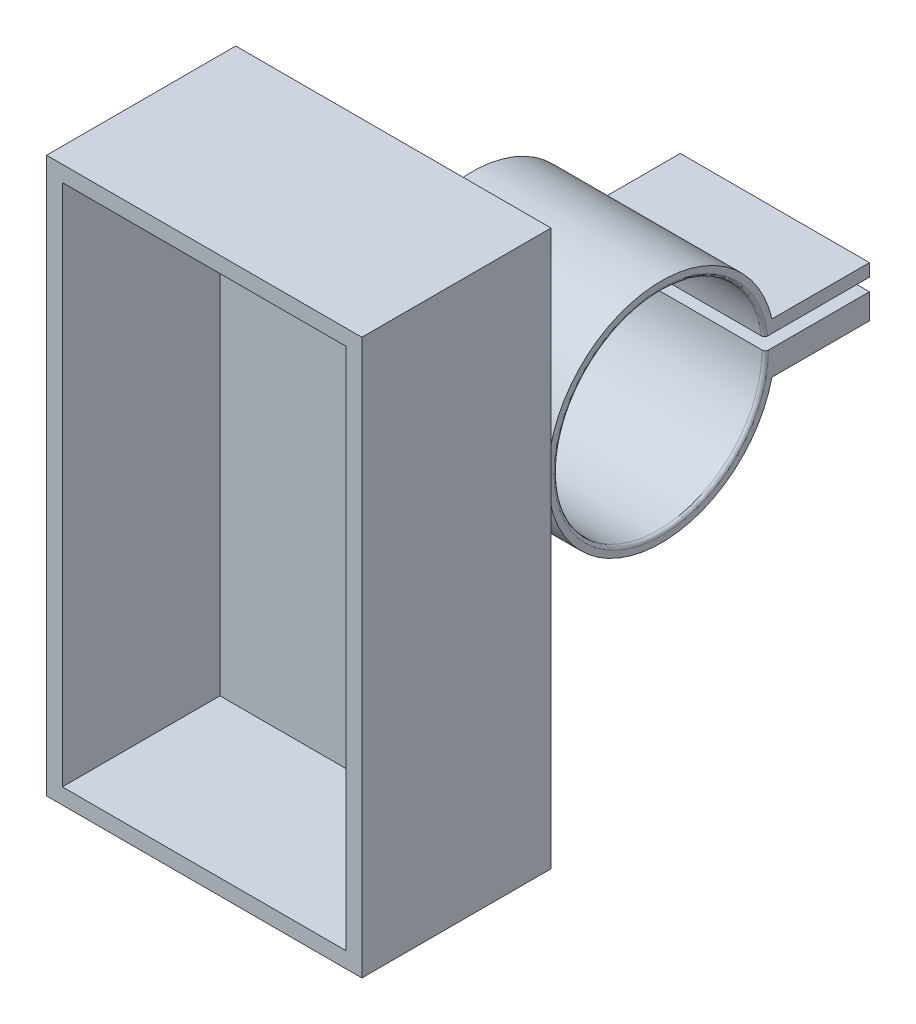
ISO-10303-21;
HEADER;
FILE_DESCRIPTION(('STEP AP214'),'2;1');
FILE_NAME('part.step','',(''),(''),'','','');
FILE_SCHEMA(('AUTOMOTIVE_DESIGN { 1 0 10303 214 1 1 1 1 }'));
ENDSEC;
DATA;
#1=APPLICATION_CONTEXT('core data for automotive mechanical design processes');
#2=APPLICATION_PROTOCOL_DEFINITION('international standard','automotive_design',2000,#1);
#3=PRODUCT_CONTEXT('',#1,'mechanical');
#4=PRODUCT('Part','Part','',(#3));
#5=PRODUCT_RELATED_PRODUCT_CATEGORY('part','',(#4));
#6=PRODUCT_DEFINITION_FORMATION('','',#4);
#7=PRODUCT_DEFINITION_CONTEXT('part definition',#1,'design');
#8=PRODUCT_DEFINITION('design','',#6,#7);
#9=PRODUCT_DEFINITION_SHAPE('','',#8);
#10=(LENGTH_UNIT() NAMED_UNIT(*) SI_UNIT(.MILLI.,.METRE.));
#11=(NAMED_UNIT(*) PLANE_ANGLE_UNIT() SI_UNIT($,.RADIAN.));
#12=(NAMED_UNIT(*) SI_UNIT($,.STERADIAN.) SOLID_ANGLE_UNIT());
#13=UNCERTAINTY_MEASURE_WITH_UNIT(LENGTH_MEASURE(1.E-05),#10,'distance_accuracy_value','');
#14=(GEOMETRIC_REPRESENTATION_CONTEXT(3) GLOBAL_UNCERTAINTY_ASSIGNED_CONTEXT((#13)) GLOBAL_UNIT_ASSIGNED_CONTEXT((#10,
#11,#12)) REPRESENTATION_CONTEXT('',''));
#15=CARTESIAN_POINT('',(0.,0.,0.));
#16=DIRECTION('',(0.,0.,1.));
#17=DIRECTION('',(1.,0.,0.));
#18=AXIS2_PLACEMENT_3D('',#15,#16,#17);
#19=CARTESIAN_POINT('',(-15.,0.,-60.4925687367722));
#20=DIRECTION('',(0.,0.,-1.));
#21=DIRECTION('',(-1.,0.,0.));
#22=AXIS2_PLACEMENT_3D('',#19,#20,#21);
#23=PLANE('',#22);
#24=DIRECTION('',(0.,1.,0.));
#25=VECTOR('',#24,1.);
#26=CARTESIAN_POINT('',(-15.,0.,-60.4925687367722));
#27=LINE('',#26,#25);
#28=CARTESIAN_POINT('',(-15.,-4.,-60.4925687367722));
#29=VERTEX_POINT('',#28);
#30=CARTESIAN_POINT('',(-15.,0.,-60.4925687367722));
#31=VERTEX_POINT('',#30);
#32=EDGE_CURVE('E191',#29,#31,#27,.T.);
#33=ORIENTED_EDGE('',*,*,#32,.T.);
#34=DIRECTION('',(1.,0.,0.));
#35=VECTOR('',#34,1.);
#36=CARTESIAN_POINT('',(-25.,0.,-60.4925687367722));
#37=LINE('',#36,#35);
#38=CARTESIAN_POINT('',(15.,0.,-60.4925687367722));
#39=VERTEX_POINT('',#38);
#40=EDGE_CURVE('E179',#31,#39,#37,.T.);
#41=ORIENTED_EDGE('',*,*,#40,.T.);
#42=DIRECTION('',(0.,1.,0.));
#43=VECTOR('',#42,1.);
#44=CARTESIAN_POINT('',(15.,0.,-60.4925687367722));
#45=LINE('',#44,#43);
#46=CARTESIAN_POINT('',(15.,-4.,-60.4925687367722));
#47=VERTEX_POINT('',#46);
#48=EDGE_CURVE('E193',#47,#39,#45,.T.);
#49=ORIENTED_EDGE('',*,*,#48,.F.);
#50=DIRECTION('',(1.,0.,0.));
#51=VECTOR('',#50,1.);
#52=CARTESIAN_POINT('',(-15.,-4.,-60.4925687367722));
#53=LINE('',#52,#51);
#54=EDGE_CURVE('E226',#29,#47,#53,.T.);
#55=ORIENTED_EDGE('',*,*,#54,.F.);
#56=EDGE_LOOP('',(#33,#41,#49,#55));
#57=FACE_BOUND('',#56,.T.);
#58=ADVANCED_FACE('F50',(#57),#23,.T.);
#59=CARTESIAN_POINT('',(-25.,-44.,30.));
#60=DIRECTION('',(1.,0.,0.));
#61=DIRECTION('',(0.,0.,-1.));
#62=AXIS2_PLACEMENT_3D('',#59,#60,#61);
#63=PLANE('',#62);
#64=DIRECTION('',(0.,-1.,0.));
#65=VECTOR('',#64,1.);
#66=CARTESIAN_POINT('',(-25.,-44.,0.));
#67=LINE('',#66,#65);
#68=CARTESIAN_POINT('',(-25.,44.,0.));
#69=VERTEX_POINT('',#68);
#70=CARTESIAN_POINT('',(-25.,-44.,0.));
#71=VERTEX_POINT('',#70);
#72=EDGE_CURVE('E281',#69,#71,#67,.T.);
#73=ORIENTED_EDGE('',*,*,#72,.T.);
#74=DIRECTION('',(0.,0.,-1.));
#75=VECTOR('',#74,1.);
#76=CARTESIAN_POINT('',(-25.,-44.,30.));
#77=LINE('',#76,#75);
#78=CARTESIAN_POINT('',(-25.,-44.,30.));
#79=VERTEX_POINT('',#78);
#80=EDGE_CURVE('E329',#79,#71,#77,.T.);
#81=ORIENTED_EDGE('',*,*,#80,.F.);
#82=DIRECTION('',(0.,-1.,0.));
#83=VECTOR('',#82,1.);
#84=CARTESIAN_POINT('',(-25.,-44.,30.));
#85=LINE('',#84,#83);
#86=CARTESIAN_POINT('',(-25.,44.,30.));
#87=VERTEX_POINT('',#86);
#88=EDGE_CURVE('E291',#87,#79,#85,.T.);
#89=ORIENTED_EDGE('',*,*,#88,.F.);
#90=DIRECTION('',(0.,0.,-1.));
#91=VECTOR('',#90,1.);
#92=CARTESIAN_POINT('',(-25.,44.,30.));
#93=LINE('',#92,#91);
#94=EDGE_CURVE('E310',#87,#69,#93,.T.);
#95=ORIENTED_EDGE('',*,*,#94,.T.);
#96=EDGE_LOOP('',(#73,#81,#89,#95));
#97=FACE_BOUND('',#96,.T.);
#98=ADVANCED_FACE('F407',(#97),#63,.F.);
#99=CARTESIAN_POINT('',(25.,-44.,30.));
#100=DIRECTION('',(0.,1.,0.));
#101=DIRECTION('',(-1.,0.,0.));
#102=AXIS2_PLACEMENT_3D('',#99,#100,#101);
#103=PLANE('',#102);
#104=DIRECTION('',(1.,0.,0.));
#105=VECTOR('',#104,1.);
#106=CARTESIAN_POINT('',(25.,-44.,0.));
#107=LINE('',#106,#105);
#108=CARTESIAN_POINT('',(25.,-44.,0.));
#109=VERTEX_POINT('',#108);
#110=EDGE_CURVE('E311',#71,#109,#107,.T.);
#111=ORIENTED_EDGE('',*,*,#110,.T.);
#112=DIRECTION('',(0.,0.,-1.));
#113=VECTOR('',#112,1.);
#114=CARTESIAN_POINT('',(25.,-44.,30.));
#115=LINE('',#114,#113);
#116=CARTESIAN_POINT('',(25.,-44.,30.));
#117=VERTEX_POINT('',#116);
#118=EDGE_CURVE('E328',#117,#109,#115,.T.);
#119=ORIENTED_EDGE('',*,*,#118,.F.);
#120=DIRECTION('',(1.,0.,0.));
#121=VECTOR('',#120,1.);
#122=CARTESIAN_POINT('',(25.,-44.,30.));
#123=LINE('',#122,#121);
#124=EDGE_CURVE('E300',#79,#117,#123,.T.);
#125=ORIENTED_EDGE('',*,*,#124,.F.);
#126=ORIENTED_EDGE('',*,*,#80,.T.);
#127=EDGE_LOOP('',(#111,#119,#125,#126));
#128=FACE_BOUND('',#127,.T.);
#129=ADVANCED_FACE('F411',(#128),#103,.F.);
#130=CARTESIAN_POINT('',(25.,-44.,30.));
#131=DIRECTION('',(-1.,0.,0.));
#132=DIRECTION('',(0.,0.,1.));
#133=AXIS2_PLACEMENT_3D('',#130,#131,#132);
#134=PLANE('',#133);
#135=DIRECTION('',(0.,1.,0.));
#136=VECTOR('',#135,1.);
#137=CARTESIAN_POINT('',(25.,-44.,0.));
#138=LINE('',#137,#136);
#139=CARTESIAN_POINT('',(25.,44.,0.));
#140=VERTEX_POINT('',#139);
#141=EDGE_CURVE('E313',#109,#140,#138,.T.);
#142=ORIENTED_EDGE('',*,*,#141,.T.);
#143=DIRECTION('',(0.,0.,-1.));
#144=VECTOR('',#143,1.);
#145=CARTESIAN_POINT('',(25.,44.,30.));
#146=LINE('',#145,#144);
#147=CARTESIAN_POINT('',(25.,44.,30.));
#148=VERTEX_POINT('',#147);
#149=EDGE_CURVE('E325',#148,#140,#146,.T.);
#150=ORIENTED_EDGE('',*,*,#149,.F.);
#151=DIRECTION('',(0.,1.,0.));
#152=VECTOR('',#151,1.);
#153=CARTESIAN_POINT('',(25.,-44.,30.));
#154=LINE('',#153,#152);
#155=EDGE_CURVE('E301',#117,#148,#154,.T.);
#156=ORIENTED_EDGE('',*,*,#155,.F.);
#157=ORIENTED_EDGE('',*,*,#118,.T.);
#158=EDGE_LOOP('',(#142,#150,#156,#157));
#159=FACE_BOUND('',#158,.T.);
#160=ADVANCED_FACE('F420',(#159),#134,.F.);
#161=CARTESIAN_POINT('',(25.,44.,30.));
#162=DIRECTION('',(0.,-1.,0.));
#163=DIRECTION('',(1.,0.,0.));
#164=AXIS2_PLACEMENT_3D('',#161,#162,#163);
#165=PLANE('',#164);
#166=DIRECTION('',(-1.,0.,0.));
#167=VECTOR('',#166,1.);
#168=CARTESIAN_POINT('',(25.,44.,0.));
#169=LINE('',#168,#167);
#170=EDGE_CURVE('E296',#140,#69,#169,.T.);
#171=ORIENTED_EDGE('',*,*,#170,.T.);
#172=ORIENTED_EDGE('',*,*,#94,.F.);
#173=DIRECTION('',(-1.,0.,0.));
#174=VECTOR('',#173,1.);
#175=CARTESIAN_POINT('',(25.,44.,30.));
#176=LINE('',#175,#174);
#177=EDGE_CURVE('E302',#148,#87,#176,.T.);
#178=ORIENTED_EDGE('',*,*,#177,.F.);
#179=ORIENTED_EDGE('',*,*,#149,.T.);
#180=EDGE_LOOP('',(#171,#172,#178,#179));
#181=FACE_BOUND('',#180,.T.);
#182=ADVANCED_FACE('F423',(#181),#165,.F.);
#183=CARTESIAN_POINT('',(0.,0.,30.));
#184=DIRECTION('',(0.,0.,1.));
#185=DIRECTION('',(1.,0.,0.));
#186=AXIS2_PLACEMENT_3D('',#183,#184,#185);
#187=PLANE('',#186);
#188=DIRECTION('',(0.,-1.,0.));
#189=VECTOR('',#188,1.);
#190=CARTESIAN_POINT('',(-22.5,-41.5,30.));
#191=LINE('',#190,#189);
#192=CARTESIAN_POINT('',(-22.5,41.5,30.));
#193=VERTEX_POINT('',#192);
#194=CARTESIAN_POINT('',(-22.5,-41.5,30.));
#195=VERTEX_POINT('',#194);
#196=EDGE_CURVE('E267',#193,#195,#191,.T.);
#197=ORIENTED_EDGE('',*,*,#196,.F.);
#198=DIRECTION('',(-1.,0.,0.));
#199=VECTOR('',#198,1.);
#200=CARTESIAN_POINT('',(22.5,41.5,30.));
#201=LINE('',#200,#199);
#202=CARTESIAN_POINT('',(22.5,41.5,30.));
#203=VERTEX_POINT('',#202);
#204=EDGE_CURVE('E254',#203,#193,#201,.T.);
#205=ORIENTED_EDGE('',*,*,#204,.F.);
#206=DIRECTION('',(0.,1.,0.));
#207=VECTOR('',#206,1.);
#208=CARTESIAN_POINT('',(22.5,-41.5,30.));
#209=LINE('',#208,#207);
#210=CARTESIAN_POINT('',(22.5,-41.5,30.));
#211=VERTEX_POINT('',#210);
#212=EDGE_CURVE('E271',#211,#203,#209,.T.);
#213=ORIENTED_EDGE('',*,*,#212,.F.);
#214=DIRECTION('',(1.,0.,0.));
#215=VECTOR('',#214,1.);
#216=CARTESIAN_POINT('',(22.5,-41.5,30.));
#217=LINE('',#216,#215);
#218=EDGE_CURVE('E266',#195,#211,#217,.T.);
#219=ORIENTED_EDGE('',*,*,#218,.F.);
#220=EDGE_LOOP('',(#197,#205,#213,#219));
#221=FACE_BOUND('',#220,.T.);
#222=ORIENTED_EDGE('',*,*,#88,.T.);
#223=ORIENTED_EDGE('',*,*,#124,.T.);
#224=ORIENTED_EDGE('',*,*,#155,.T.);
#225=ORIENTED_EDGE('',*,*,#177,.T.);
#226=EDGE_LOOP('',(#222,#223,#224,#225));
#227=FACE_BOUND('',#226,.T.);
#228=ADVANCED_FACE('F424',(#221,#227),#187,.T.);
#229=CARTESIAN_POINT('',(0.,0.,0.));
#230=DIRECTION('',(0.,0.,1.));
#231=DIRECTION('',(1.,0.,0.));
#232=AXIS2_PLACEMENT_3D('',#229,#230,#231);
#233=PLANE('',#232);
#234=CARTESIAN_POINT('',(0.,0.,0.));
#235=DIRECTION('',(0.,0.,1.));
#236=DIRECTION('',(1.,0.,0.));
#237=AXIS2_PLACEMENT_3D('',#234,#235,#236);
#238=CIRCLE('',#237,14.25);
#239=CARTESIAN_POINT('',(14.25,0.,0.));
#240=VERTEX_POINT('',#239);
#241=EDGE_CURVE('E336',#240,#240,#238,.T.);
#242=ORIENTED_EDGE('',*,*,#241,.T.);
#243=EDGE_LOOP('',(#242));
#244=FACE_BOUND('',#243,.T.);
#245=ORIENTED_EDGE('',*,*,#72,.F.);
#246=ORIENTED_EDGE('',*,*,#170,.F.);
#247=ORIENTED_EDGE('',*,*,#141,.F.);
#248=ORIENTED_EDGE('',*,*,#110,.F.);
#249=EDGE_LOOP('',(#245,#246,#247,#248));
#250=FACE_BOUND('',#249,.T.);
#251=ADVANCED_FACE('F430',(#244,#250),#233,.F.);
#252=CARTESIAN_POINT('',(-22.5,-41.5,5.));
#253=DIRECTION('',(-1.,0.,0.));
#254=DIRECTION('',(0.,0.,1.));
#255=AXIS2_PLACEMENT_3D('',#252,#253,#254);
#256=PLANE('',#255);
#257=ORIENTED_EDGE('',*,*,#196,.T.);
#258=DIRECTION('',(0.,0.,1.));
#259=VECTOR('',#258,1.);
#260=CARTESIAN_POINT('',(-22.5,-41.5,5.));
#261=LINE('',#260,#259);
#262=CARTESIAN_POINT('',(-22.5,-41.5,5.));
#263=VERTEX_POINT('',#262);
#264=EDGE_CURVE('E264',#263,#195,#261,.T.);
#265=ORIENTED_EDGE('',*,*,#264,.F.);
#266=DIRECTION('',(0.,-1.,0.));
#267=VECTOR('',#266,1.);
#268=CARTESIAN_POINT('',(-22.5,-41.5,5.));
#269=LINE('',#268,#267);
#270=CARTESIAN_POINT('',(-22.5,41.5,5.));
#271=VERTEX_POINT('',#270);
#272=EDGE_CURVE('E247',#271,#263,#269,.T.);
#273=ORIENTED_EDGE('',*,*,#272,.F.);
#274=DIRECTION('',(0.,0.,1.));
#275=VECTOR('',#274,1.);
#276=CARTESIAN_POINT('',(-22.5,41.5,5.));
#277=LINE('',#276,#275);
#278=EDGE_CURVE('E277',#271,#193,#277,.T.);
#279=ORIENTED_EDGE('',*,*,#278,.T.);
#280=EDGE_LOOP('',(#257,#265,#273,#279));
#281=FACE_BOUND('',#280,.T.);
#282=ADVANCED_FACE('F427',(#281),#256,.F.);
#283=CARTESIAN_POINT('',(22.5,41.5,5.));
#284=DIRECTION('',(0.,1.,0.));
#285=DIRECTION('',(0.,0.,1.));
#286=AXIS2_PLACEMENT_3D('',#283,#284,#285);
#287=PLANE('',#286);
#288=ORIENTED_EDGE('',*,*,#204,.T.);
#289=ORIENTED_EDGE('',*,*,#278,.F.);
#290=DIRECTION('',(-1.,0.,0.));
#291=VECTOR('',#290,1.);
#292=CARTESIAN_POINT('',(22.5,41.5,5.));
#293=LINE('',#292,#291);
#294=CARTESIAN_POINT('',(22.5,41.5,5.));
#295=VERTEX_POINT('',#294);
#296=EDGE_CURVE('E263',#295,#271,#293,.T.);
#297=ORIENTED_EDGE('',*,*,#296,.F.);
#298=DIRECTION('',(0.,0.,1.));
#299=VECTOR('',#298,1.);
#300=CARTESIAN_POINT('',(22.5,41.5,5.));
#301=LINE('',#300,#299);
#302=EDGE_CURVE('E282',#295,#203,#301,.T.);
#303=ORIENTED_EDGE('',*,*,#302,.T.);
#304=EDGE_LOOP('',(#288,#289,#297,#303));
#305=FACE_BOUND('',#304,.T.);
#306=ADVANCED_FACE('F440',(#305),#287,.F.);
#307=CARTESIAN_POINT('',(22.5,-41.5,5.));
#308=DIRECTION('',(1.,0.,0.));
#309=DIRECTION('',(0.,0.,-1.));
#310=AXIS2_PLACEMENT_3D('',#307,#308,#309);
#311=PLANE('',#310);
#312=ORIENTED_EDGE('',*,*,#212,.T.);
#313=ORIENTED_EDGE('',*,*,#302,.F.);
#314=DIRECTION('',(0.,1.,0.));
#315=VECTOR('',#314,1.);
#316=CARTESIAN_POINT('',(22.5,-41.5,5.));
#317=LINE('',#316,#315);
#318=CARTESIAN_POINT('',(22.5,-41.5,5.));
#319=VERTEX_POINT('',#318);
#320=EDGE_CURVE('E260',#319,#295,#317,.T.);
#321=ORIENTED_EDGE('',*,*,#320,.F.);
#322=DIRECTION('',(0.,0.,1.));
#323=VECTOR('',#322,1.);
#324=CARTESIAN_POINT('',(22.5,-41.5,5.));
#325=LINE('',#324,#323);
#326=EDGE_CURVE('E290',#319,#211,#325,.T.);
#327=ORIENTED_EDGE('',*,*,#326,.T.);
#328=EDGE_LOOP('',(#312,#313,#321,#327));
#329=FACE_BOUND('',#328,.T.);
#330=ADVANCED_FACE('F442',(#329),#311,.F.);
#331=CARTESIAN_POINT('',(22.5,-41.5,5.));
#332=DIRECTION('',(0.,-1.,0.));
#333=DIRECTION('',(0.,0.,-1.));
#334=AXIS2_PLACEMENT_3D('',#331,#332,#333);
#335=PLANE('',#334);
#336=ORIENTED_EDGE('',*,*,#218,.T.);
#337=ORIENTED_EDGE('',*,*,#326,.F.);
#338=DIRECTION('',(1.,0.,0.));
#339=VECTOR('',#338,1.);
#340=CARTESIAN_POINT('',(22.5,-41.5,5.));
#341=LINE('',#340,#339);
#342=EDGE_CURVE('E255',#263,#319,#341,.T.);
#343=ORIENTED_EDGE('',*,*,#342,.F.);
#344=ORIENTED_EDGE('',*,*,#264,.T.);
#345=EDGE_LOOP('',(#336,#337,#343,#344));
#346=FACE_BOUND('',#345,.T.);
#347=ADVANCED_FACE('F437',(#346),#335,.F.);
#348=CARTESIAN_POINT('',(0.,0.,5.));
#349=DIRECTION('',(0.,0.,1.));
#350=DIRECTION('',(1.,0.,0.));
#351=AXIS2_PLACEMENT_3D('',#348,#349,#350);
#352=PLANE('',#351);
#353=ORIENTED_EDGE('',*,*,#272,.T.);
#354=ORIENTED_EDGE('',*,*,#342,.T.);
#355=ORIENTED_EDGE('',*,*,#320,.T.);
#356=ORIENTED_EDGE('',*,*,#296,.T.);
#357=EDGE_LOOP('',(#353,#354,#355,#356));
#358=FACE_BOUND('',#357,.T.);
#359=ADVANCED_FACE('F445',(#358),#352,.T.);
#360=CARTESIAN_POINT('',(0.,0.,-15.));
#361=DIRECTION('',(0.,0.,1.));
#362=DIRECTION('',(1.,0.,0.));
#363=AXIS2_PLACEMENT_3D('',#360,#361,#362);
#364=CYLINDRICAL_SURFACE('',#363,10.25);
#365=CARTESIAN_POINT('',(10.25,0.,-9.47936499938877));
#366=CARTESIAN_POINT('',(10.249997772282,0.264519076584649,-9.47936701620797));
#367=CARTESIAN_POINT('',(10.2397441218711,0.529124496482216,-9.4852112686551));
#368=CARTESIAN_POINT('',(10.1988524814933,1.0563624821298,-9.5084491330026));
#369=CARTESIAN_POINT('',(10.1682014925191,1.31899368172281,-9.52585010986655));
#370=CARTESIAN_POINT('',(10.0868204809152,1.84076662311007,-9.5718158341821));
#371=CARTESIAN_POINT('',(10.0360439953682,2.09989884525778,-9.60040641267984));
#372=CARTESIAN_POINT('',(9.91506466552643,2.61213502550928,-9.66803447550246));
#373=CARTESIAN_POINT('',(9.84486475035596,2.86523988631563,-9.70707038460409));
#374=CARTESIAN_POINT('',(9.68622852714192,3.36263269484833,-9.79445153895515));
#375=CARTESIAN_POINT('',(9.59788073180206,3.60695691594657,-9.84275152743456));
#376=CARTESIAN_POINT('',(9.40364867835215,4.08666902217371,-9.94769560275203));
#377=CARTESIAN_POINT('',(9.29776382352484,4.32205660288872,-10.0043399735094));
#378=CARTESIAN_POINT('',(9.06947415220393,4.78258886852613,-10.1247269366167));
#379=CARTESIAN_POINT('',(8.94707913500893,5.00773952419547,-10.1884653145558));
#380=CARTESIAN_POINT('',(8.68661251819837,5.44706409397579,-10.321794742583));
#381=CARTESIAN_POINT('',(8.54853514595756,5.66123392370104,-10.3913879453537));
#382=CARTESIAN_POINT('',(8.24718552075165,6.09266328197374,-10.5402036239691));
#383=CARTESIAN_POINT('',(8.08281638148095,6.30904201607955,-10.6197587310245));
#384=CARTESIAN_POINT('',(7.73814156015187,6.72734129410007,-10.7822623976682));
#385=CARTESIAN_POINT('',(7.55783525242426,6.9292612698219,-10.8652110904149));
#386=CARTESIAN_POINT('',(7.18198830136747,7.31811047700305,-11.0327808893572));
#387=CARTESIAN_POINT('',(6.98643093216818,7.50502278048896,-11.1174037535339));
#388=CARTESIAN_POINT('',(6.58108602120329,7.86288155681463,-11.2863340584831));
#389=CARTESIAN_POINT('',(6.37129804311026,8.03382753972565,-11.3706414895003));
#390=CARTESIAN_POINT('',(5.91488391073257,8.37655288293503,-11.5459318841658));
#391=CARTESIAN_POINT('',(5.66672531682515,8.54643210418336,-11.6366536480956));
#392=CARTESIAN_POINT('',(5.1549230262351,8.86453935462094,-11.8124258786654));
#393=CARTESIAN_POINT('',(4.89127716045122,9.01276434079662,-11.8974755473097));
#394=CARTESIAN_POINT('',(4.35008434235251,9.28606725394415,-12.0587906410431));
#395=CARTESIAN_POINT('',(4.07255489521586,9.4111734400318,-12.1350667467784));
#396=CARTESIAN_POINT('',(3.50489612393043,9.63698227375308,-12.2758685051866));
#397=CARTESIAN_POINT('',(3.21477093133944,9.73769285318384,-12.3403979753684));
#398=CARTESIAN_POINT('',(2.68898225772109,9.89392133115211,-12.4421781801048));
#399=CARTESIAN_POINT('',(2.45537095316852,9.95450712622937,-12.4823071358135));
#400=CARTESIAN_POINT('',(1.98300837340899,10.0592578610227,-12.5523654666443));
#401=CARTESIAN_POINT('',(1.74425812652716,10.1034260542443,-12.5822968625368));
#402=CARTESIAN_POINT('',(1.26330476014067,10.1747534875964,-12.6309219714102));
#403=CARTESIAN_POINT('',(1.02110486383679,10.2019276604604,-12.6496255497513));
#404=CARTESIAN_POINT('',(0.534747386523672,10.2389461901088,-12.6751597867866));
#405=CARTESIAN_POINT('',(0.290589766279507,10.2487901987012,-12.6819902069293));
#406=CARTESIAN_POINT('',(-0.198166247123225,10.2510014587125,-12.6835219539042));
#407=CARTESIAN_POINT('',(-0.442764796176201,10.2433455803668,-12.678207228386));
#408=CARTESIAN_POINT('',(-0.93023119910778,10.2106242542887,-12.6556157153616));
#409=CARTESIAN_POINT('',(-1.17309904626852,10.1855587390165,-12.6383388814488));
#410=CARTESIAN_POINT('',(-1.65550574864583,10.1183570148594,-12.5924412208023));
#411=CARTESIAN_POINT('',(-1.89504259388151,10.0762109253703,-12.5638138283159));
#412=CARTESIAN_POINT('',(-2.36910921634494,9.97539772181839,-12.4962039797184));
#413=CARTESIAN_POINT('',(-2.60363887304666,9.91673021055638,-12.4572212746515));
#414=CARTESIAN_POINT('',(-3.06556307278674,9.78378120583667,-12.3702981595879));
#415=CARTESIAN_POINT('',(-3.29298045201288,9.70955724126812,-12.3223908241364));
#416=CARTESIAN_POINT('',(-3.74058008280692,9.54606599529802,-12.2188939536657));
#417=CARTESIAN_POINT('',(-3.96075981439855,9.45679353929937,-12.1633017773125));
#418=CARTESIAN_POINT('',(-4.60906270031334,9.16749207849313,-11.9871703826154));
#419=CARTESIAN_POINT('',(-5.02518101941444,8.94591149227808,-11.8572302605224));
#420=CARTESIAN_POINT('',(-5.88338568601482,8.41089592254884,-11.5619505635708));
#421=CARTESIAN_POINT('',(-6.31905767401842,8.08845317920035,-11.3942687992847));
#422=CARTESIAN_POINT('',(-6.93007100212049,7.55709231450766,-11.1414003860152));
#423=CARTESIAN_POINT('',(-7.12678974729825,7.37186747208288,-11.0568233998803));
#424=CARTESIAN_POINT('',(-7.50535496227567,6.98606905056694,-10.8890354908677));
#425=CARTESIAN_POINT('',(-7.68719903401225,6.78549300663765,-10.8058247899811));
#426=CARTESIAN_POINT('',(-8.05463493304055,6.34636130367998,-10.6334327144376));
#427=CARTESIAN_POINT('',(-8.23834028133085,6.10607276065714,-10.5446350523361));
#428=CARTESIAN_POINT('',(-8.58466358117383,5.6087273259798,-10.3734801024955));
#429=CARTESIAN_POINT('',(-8.74729007019546,5.3516772869605,-10.2911202126955));
#430=CARTESIAN_POINT('',(-9.04998636157031,4.82215933647048,-10.1351171397251));
#431=CARTESIAN_POINT('',(-9.19006110526259,4.54969482021346,-10.0614720479849));
#432=CARTESIAN_POINT('',(-9.44607930661591,3.99104698345921,-9.92504427403318));
#433=CARTESIAN_POINT('',(-9.56202575158638,3.70486536667185,-9.86226024728267));
#434=CARTESIAN_POINT('',(-9.76106877683551,3.14119028883933,-9.75340896982437));
#435=CARTESIAN_POINT('',(-9.84588553448825,2.86447007118699,-9.70648452097918));
#436=CARTESIAN_POINT('',(-9.99211181758109,2.30310780059989,-9.62506289284931));
#437=CARTESIAN_POINT('',(-10.0535222041813,2.01846603952568,-9.59056525636369));
#438=CARTESIAN_POINT('',(-10.1519671963241,1.4439317050169,-9.53505432878852));
#439=CARTESIAN_POINT('',(-10.189021547722,1.15404358132125,-9.51403011491134));
#440=CARTESIAN_POINT('',(-10.2382276924758,0.571496474633397,-9.48607766995324));
#441=CARTESIAN_POINT('',(-10.2503822289675,0.278837800433299,-9.47914788613314));
#442=CARTESIAN_POINT('',(-10.2496464040508,-0.271149396969233,-9.47956587334594));
#443=CARTESIAN_POINT('',(-10.2395957018111,-0.528488532145676,-9.48529482688484));
#444=CARTESIAN_POINT('',(-10.2002210891216,-1.04118963735186,-9.50767214025927));
#445=CARTESIAN_POINT('',(-10.1708990484919,-1.29655179676776,-9.52431944073138));
#446=CARTESIAN_POINT('',(-10.0933531995476,-1.80346124099976,-9.56813225679973));
#447=CARTESIAN_POINT('',(-10.0451294749466,-2.05500854270637,-9.59529772581208));
#448=CARTESIAN_POINT('',(-9.93035506290933,-2.55259576736652,-9.65951116446066));
#449=CARTESIAN_POINT('',(-9.86380381575373,-2.79863552187238,-9.69655943591484));
#450=CARTESIAN_POINT('',(-9.71383669852147,-3.28133140146672,-9.77930134854855));
#451=CARTESIAN_POINT('',(-9.63059028276788,-3.51805529762093,-9.8249078471487));
#452=CARTESIAN_POINT('',(-9.44761573217907,-3.98341490915179,-9.92405156519192));
#453=CARTESIAN_POINT('',(-9.34788176618569,-4.21204772809716,-9.97759158979122));
#454=CARTESIAN_POINT('',(-9.13282406546957,-4.66001584079167,-10.0915054494092));
#455=CARTESIAN_POINT('',(-9.01750350200322,-4.87935301394384,-10.1518778938952));
#456=CARTESIAN_POINT('',(-8.77206454775717,-5.30795618018436,-10.2783315545162));
#457=CARTESIAN_POINT('',(-8.64194082516845,-5.51721850564016,-10.3444148255065));
#458=CARTESIAN_POINT('',(-8.35352278121774,-5.94597758022981,-10.4881429554006));
#459=CARTESIAN_POINT('',(-8.19370656639242,-6.16428772819165,-10.5662762688494));
#460=CARTESIAN_POINT('',(-7.85802313299172,-6.58686805012573,-10.7263279305793));
#461=CARTESIAN_POINT('',(-7.68214863933788,-6.79113178627599,-10.8082479860333));
#462=CARTESIAN_POINT('',(-7.31516505188381,-7.18493998299601,-10.9741437890637));
#463=CARTESIAN_POINT('',(-7.12404291319149,-7.37447156001425,-11.058121253334));
#464=CARTESIAN_POINT('',(-6.72752867936334,-7.73790629448114,-11.2262145569714));
#465=CARTESIAN_POINT('',(-6.52213603190281,-7.91180884642705,-11.3103304015711));
#466=CARTESIAN_POINT('',(-6.07442669975909,-8.2615485261043,-11.485953666827));
#467=CARTESIAN_POINT('',(-5.83053633706579,-8.43548237750633,-11.5772527274582));
#468=CARTESIAN_POINT('',(-5.32712404825027,-8.76209346115811,-11.75485264458));
#469=CARTESIAN_POINT('',(-5.06759991232121,-8.91476767824772,-11.841152791085));
#470=CARTESIAN_POINT('',(-4.53440208671995,-9.19742594230974,-12.0057074086744));
#471=CARTESIAN_POINT('',(-4.26074412936347,-9.32743454163621,-12.0839705475252));
#472=CARTESIAN_POINT('',(-3.7005113451067,-9.56352655906522,-12.2295055172165));
#473=CARTESIAN_POINT('',(-3.41394051216499,-9.66961731484302,-12.2967807172601));
#474=CARTESIAN_POINT('',(-2.89199587721539,-9.83652052783761,-12.4045344971486));
#475=CARTESIAN_POINT('',(-2.65870573257551,-9.90216401255776,-12.4476688831337));
#476=CARTESIAN_POINT('',(-2.18652964603533,-10.017015040232,-12.5239587900922));
#477=CARTESIAN_POINT('',(-1.94764482682675,-10.0662258510203,-12.5571162949581));
#478=CARTESIAN_POINT('',(-1.46593476099523,-10.1475683117232,-12.6123115043365));
#479=CARTESIAN_POINT('',(-1.22311337196106,-10.1797157499175,-12.6343594872297));
#480=CARTESIAN_POINT('',(-0.734995046002121,-10.2265531746891,-12.6665858910638));
#481=CARTESIAN_POINT('',(-0.48969806941139,-10.2412428810945,-12.6767641215118));
#482=CARTESIAN_POINT('',(0.00199391500462832,-10.2529549532952,-12.6848738725892));
#483=CARTESIAN_POINT('',(0.248390126661427,-10.2499433578976,-12.6827818518948));
#484=CARTESIAN_POINT('',(0.739914698825937,-10.2262196999597,-12.6663762748288));
#485=CARTESIAN_POINT('',(0.985043054643484,-10.2055075719872,-12.6520626732785));
#486=CARTESIAN_POINT('',(1.47235022120758,-10.1466721223633,-12.6117387739645));
#487=CARTESIAN_POINT('',(1.71452736389064,-10.1085393839905,-12.585722150242));
#488=CARTESIAN_POINT('',(2.19417218406893,-10.0153784215539,-12.5229168576762));
#489=CARTESIAN_POINT('',(2.43163977569422,-9.96034988972743,-12.4861279926134));
#490=CARTESIAN_POINT('',(2.89679952074493,-9.83504728342829,-12.4036437187107));
#491=CARTESIAN_POINT('',(3.12458668778807,-9.76502666129928,-12.35809752686));
#492=CARTESIAN_POINT('',(3.57324020221696,-9.60993437035669,-12.2590622254572));
#493=CARTESIAN_POINT('',(3.79410414785559,-9.5248575449251,-12.2055703956052));
#494=CARTESIAN_POINT('',(4.44487193832846,-9.24812016742324,-12.0352971408735));
#495=CARTESIAN_POINT('',(4.8631923493345,-9.03488700573248,-11.9086727815464));
#496=CARTESIAN_POINT('',(5.72496924385396,-8.51920105558191,-11.6198858699287));
#497=CARTESIAN_POINT('',(6.16240681968389,-8.20807255308407,-11.4552524336377));
#498=CARTESIAN_POINT('',(6.77750771694413,-7.69411782238787,-11.2055496630691));
#499=CARTESIAN_POINT('',(6.97583019979468,-7.51477243657646,-11.1217936813681));
#500=CARTESIAN_POINT('',(7.35812399046556,-7.14086665772668,-10.9551443540285));
#501=CARTESIAN_POINT('',(7.54209303888388,-6.94630387890247,-10.8722511459733));
#502=CARTESIAN_POINT('',(7.91631229049929,-6.51804831284799,-10.6991769434172));
#503=CARTESIAN_POINT('',(8.10458116566939,-6.28247958487988,-10.6093437841493));
#504=CARTESIAN_POINT('',(8.46046511910795,-5.79432635076227,-10.435513560322));
#505=CARTESIAN_POINT('',(8.62808771969152,-5.54174809409541,-10.351514375092));
#506=CARTESIAN_POINT('',(8.94125851803259,-5.02083079577813,-10.1916388130479));
#507=CARTESIAN_POINT('',(9.08680877109352,-4.75249322481455,-10.1157616801292));
#508=CARTESIAN_POINT('',(9.35423941528465,-4.20170924201309,-9.97432541105525));
#509=CARTESIAN_POINT('',(9.47612633535899,-3.91926674897732,-9.90876342979832));
#510=CARTESIAN_POINT('',(9.67526367811933,-3.39354727480499,-9.80049186361761));
#511=CARTESIAN_POINT('',(9.75659691704004,-3.15221881009947,-9.75579160224726));
#512=CARTESIAN_POINT('',(9.90137740723689,-2.6627657536646,-9.67568189483599));
#513=CARTESIAN_POINT('',(9.9648278159665,-2.41464237016818,-9.64027080874316));
#514=CARTESIAN_POINT('',(10.0730047348587,-1.91378309502982,-9.57961850769514));
#515=CARTESIAN_POINT('',(10.1177773897455,-1.66106020011982,-9.55435223512476));
#516=CARTESIAN_POINT('',(10.1882648113444,-1.15223860920685,-9.51447180275596));
#517=CARTESIAN_POINT('',(10.2139906354492,-0.896141959829225,-9.49985146267976));
#518=CARTESIAN_POINT('',(10.236691016893,-0.532947417528673,-9.48694096180553));
#519=CARTESIAN_POINT('',(10.241679945674,-0.42644910368736,-9.48410172453271));
#520=CARTESIAN_POINT('',(10.2483350472964,-0.213305214843409,-9.48031324517058));
#521=CARTESIAN_POINT('',(10.2500008982625,-0.106659626576729,-9.47936418616506));
#522=CARTESIAN_POINT('',(10.25,0.,-9.47936499938877));
#523=B_SPLINE_CURVE_WITH_KNOTS('',3,(#365,#366,#367,#368,#369,#370,#371,#372,#373,#374,#375,
#376,#377,#378,#379,#380,#381,#382,#383,#384,#385,#386,#387,#388,#389,#390,#391,#392,#393,#394,
#395,#396,#397,#398,#399,#400,#401,#402,#403,#404,#405,#406,#407,#408,#409,#410,#411,#412,#413,
#414,#415,#416,#417,#418,#419,#420,#421,#422,#423,#424,#425,#426,#427,#428,#429,#430,#431,#432,
#433,#434,#435,#436,#437,#438,#439,#440,#441,#442,#443,#444,#445,#446,#447,#448,#449,#450,#451,
#452,#453,#454,#455,#456,#457,#458,#459,#460,#461,#462,#463,#464,#465,#466,#467,#468,#469,#470,
#471,#472,#473,#474,#475,#476,#477,#478,#479,#480,#481,#482,#483,#484,#485,#486,#487,#488,#489,
#490,#491,#492,#493,#494,#495,#496,#497,#498,#499,#500,#501,#502,#503,#504,#505,#506,#507,#508,
#509,#510,#511,#512,#513,#514,#515,#516,#517,#518,#519,#520,#521,#522),.UNSPECIFIED.,.T.,.F.,(4,
2,2,2,2,2,2,2,2,2,2,2,2,2,2,2,2,2,2,2,2,2,2,2,2,2,2,2,2,2,2,2,2,2,2,2,2,2,2,2,2,2,2,2,2,2,2,2,2,
2,2,2,2,2,2,2,2,2,2,2,2,2,2,2,2,2,2,2,2,2,2,2,2,2,2,2,2,2,4),(0.,0.793445699109753,
1.58739753759623,2.38319311789402,3.17886875465465,3.97075205481194,4.76266230518596,
5.55410458333749,6.34583913888313,7.19437837647321,8.04295094124411,8.8924675904174,
9.74201029856779,10.6832148302329,11.624551499967,12.5647298098344,13.5046020259332,
14.2378090633033,14.9708707221559,15.7032873275039,16.4357186481567,17.1691185898199,
17.9025213766886,18.6363490222081,19.370194311529,20.1013722161059,20.8328020594295,
22.2949325934273,23.9898631389846,24.8385881334854,25.687449689039,26.6319596306501,
27.5760858185183,28.5200048554331,29.4638069567065,30.3421746895656,31.2205101026669,
32.0981325530263,32.9756583132331,33.7475122146744,34.5192912373032,35.2910668418398,
36.0628660188806,36.8271955080344,37.5917958984856,38.3562409565093,39.1209622297126,
39.9649290152673,40.8092800687716,41.6543614043125,42.4994754660588,43.4378275513089,
44.3763125836439,45.3137746059713,46.2509486349044,46.9886740504942,47.7262526730524,
48.463147638996,49.2000544309006,49.9383754912364,50.6766992808842,51.4154226449912,
52.1541594659907,52.8812749085927,53.6086398655321,55.062616903003,56.7400709183012,
57.5800411074373,58.4201432522616,59.3629428971072,60.3053980174659,61.2477653255874,
62.1898722547115,62.9647291342734,63.7394491166323,64.5122435975997,65.2845890901276,
65.6044920138884,65.9244259221292),.UNSPECIFIED.);
#524=CARTESIAN_POINT('',(10.25,0.,-9.47936499938877));
#525=VERTEX_POINT('',#524);
#526=EDGE_CURVE('E250',#525,#525,#523,.T.);
#527=ORIENTED_EDGE('',*,*,#526,.T.);
#528=EDGE_LOOP('',(#527));
#529=FACE_BOUND('',#528,.T.);
#530=CARTESIAN_POINT('',(0.,0.,-4.));
#531=DIRECTION('',(0.,0.,1.));
#532=DIRECTION('',(1.,0.,0.));
#533=AXIS2_PLACEMENT_3D('',#530,#531,#532);
#534=CIRCLE('',#533,10.25);
#535=CARTESIAN_POINT('',(10.25,0.,-4.));
#536=VERTEX_POINT('',#535);
#537=EDGE_CURVE('E331',#536,#536,#534,.F.);
#538=ORIENTED_EDGE('',*,*,#537,.T.);
#539=EDGE_LOOP('',(#538));
#540=FACE_BOUND('',#539,.T.);
#541=ADVANCED_FACE('F355',(#529,#540),#364,.T.);
#542=CARTESIAN_POINT('',(0.,0.,-4.));
#543=DIRECTION('',(0.,0.,1.));
#544=DIRECTION('',(1.,0.,0.));
#545=AXIS2_PLACEMENT_3D('',#542,#543,#544);
#546=TOROIDAL_SURFACE('',#545,14.25,4.);
#547=ORIENTED_EDGE('',*,*,#241,.F.);
#548=EDGE_LOOP('',(#547));
#549=FACE_BOUND('',#548,.T.);
#550=ORIENTED_EDGE('',*,*,#537,.F.);
#551=EDGE_LOOP('',(#550));
#552=FACE_BOUND('',#551,.T.);
#553=ADVANCED_FACE('F359',(#549,#552),#546,.F.);
#554=CARTESIAN_POINT('',(-15.,0.,-27.4793649993888));
#555=DIRECTION('',(1.,0.,0.));
#556=DIRECTION('',(0.,0.,-1.));
#557=AXIS2_PLACEMENT_3D('',#554,#555,#556);
#558=CYLINDRICAL_SURFACE('',#557,18.);
#559=DIRECTION('',(1.,0.,0.));
#560=VECTOR('',#559,1.);
#561=CARTESIAN_POINT('',(-15.,-4.,-45.029293774173));
#562=LINE('',#561,#560);
#563=CARTESIAN_POINT('',(-15.,-4.,-45.029293774173));
#564=VERTEX_POINT('',#563);
#565=CARTESIAN_POINT('',(15.,-4.,-45.029293774173));
#566=VERTEX_POINT('',#565);
#567=EDGE_CURVE('E235',#564,#566,#562,.T.);
#568=ORIENTED_EDGE('',*,*,#567,.T.);
#569=CARTESIAN_POINT('',(15.,0.,-27.4793649993888));
#570=DIRECTION('',(1.,0.,0.));
#571=DIRECTION('',(0.,0.,-1.));
#572=AXIS2_PLACEMENT_3D('',#569,#570,#571);
#573=CIRCLE('',#572,18.);
#574=CARTESIAN_POINT('',(15.,4.,-45.029293774173));
#575=VERTEX_POINT('',#574);
#576=EDGE_CURVE('E233',#575,#566,#573,.T.);
#577=ORIENTED_EDGE('',*,*,#576,.F.);
#578=DIRECTION('',(1.,0.,0.));
#579=VECTOR('',#578,1.);
#580=CARTESIAN_POINT('',(-15.,4.,-45.029293774173));
#581=LINE('',#580,#579);
#582=CARTESIAN_POINT('',(-15.,4.,-45.029293774173));
#583=VERTEX_POINT('',#582);
#584=EDGE_CURVE('E232',#583,#575,#581,.T.);
#585=ORIENTED_EDGE('',*,*,#584,.F.);
#586=CARTESIAN_POINT('',(-15.,0.,-27.4793649993888));
#587=DIRECTION('',(1.,0.,0.));
#588=DIRECTION('',(0.,0.,-1.));
#589=AXIS2_PLACEMENT_3D('',#586,#587,#588);
#590=CIRCLE('',#589,18.);
#591=EDGE_CURVE('E242',#583,#564,#590,.T.);
#592=ORIENTED_EDGE('',*,*,#591,.T.);
#593=EDGE_LOOP('',(#568,#577,#585,#592));
#594=FACE_BOUND('',#593,.T.);
#595=ORIENTED_EDGE('',*,*,#526,.F.);
#596=EDGE_LOOP('',(#595));
#597=FACE_BOUND('',#596,.T.);
#598=ADVANCED_FACE('F353',(#594,#597),#558,.T.);
#599=CARTESIAN_POINT('',(-15.,0.,-27.4793649993888));
#600=DIRECTION('',(1.,0.,0.));
#601=DIRECTION('',(0.,0.,-1.));
#602=AXIS2_PLACEMENT_3D('',#599,#600,#601);
#603=PLANE('',#602);
#604=DIRECTION('',(0.,0.,1.));
#605=VECTOR('',#604,1.);
#606=CARTESIAN_POINT('',(-15.,2.,-27.4793649993888));
#607=LINE('',#606,#605);
#608=CARTESIAN_POINT('',(-15.,2.,-60.4925687367722));
#609=VERTEX_POINT('',#608);
#610=CARTESIAN_POINT('',(-15.,2.,-44.3613080155229));
#611=VERTEX_POINT('',#610);
#612=EDGE_CURVE('E621',#609,#611,#607,.T.);
#613=ORIENTED_EDGE('',*,*,#612,.T.);
#614=CARTESIAN_POINT('',(-15.,0.,-27.4793649993888));
#615=DIRECTION('',(1.,0.,0.));
#616=DIRECTION('',(0.,0.,-1.));
#617=AXIS2_PLACEMENT_3D('',#614,#615,#616);
#618=CIRCLE('',#617,17.);
#619=CARTESIAN_POINT('',(-15.,0.,-44.4793649993888));
#620=VERTEX_POINT('',#619);
#621=EDGE_CURVE('E396',#611,#620,#618,.T.);
#622=ORIENTED_EDGE('',*,*,#621,.T.);
#623=DIRECTION('',(0.,0.,-1.));
#624=VECTOR('',#623,1.);
#625=CARTESIAN_POINT('',(-15.,0.,-27.4793649993888));
#626=LINE('',#625,#624);
#627=EDGE_CURVE('E208',#620,#31,#626,.T.);
#628=ORIENTED_EDGE('',*,*,#627,.T.);
#629=ORIENTED_EDGE('',*,*,#32,.F.);
#630=DIRECTION('',(0.,0.,-1.));
#631=VECTOR('',#630,1.);
#632=CARTESIAN_POINT('',(-15.,-4.,-60.4925687367722));
#633=LINE('',#632,#631);
#634=EDGE_CURVE('E224',#564,#29,#633,.T.);
#635=ORIENTED_EDGE('',*,*,#634,.F.);
#636=ORIENTED_EDGE('',*,*,#591,.F.);
#637=DIRECTION('',(0.,0.,1.));
#638=VECTOR('',#637,1.);
#639=CARTESIAN_POINT('',(-15.,4.,-60.4925687367722));
#640=LINE('',#639,#638);
#641=CARTESIAN_POINT('',(-15.,4.,-60.4925687367722));
#642=VERTEX_POINT('',#641);
#643=EDGE_CURVE('E217',#642,#583,#640,.T.);
#644=ORIENTED_EDGE('',*,*,#643,.F.);
#645=EDGE_CURVE('E218',#609,#642,#27,.T.);
#646=ORIENTED_EDGE('',*,*,#645,.F.);
#647=EDGE_LOOP('',(#613,#622,#628,#629,#635,#636,#644,#646));
#648=FACE_BOUND('',#647,.T.);
#649=ADVANCED_FACE('F360',(#648),#603,.F.);
#650=CARTESIAN_POINT('',(15.,0.,-27.4793649993888));
#651=DIRECTION('',(1.,0.,0.));
#652=DIRECTION('',(0.,0.,-1.));
#653=AXIS2_PLACEMENT_3D('',#650,#651,#652);
#654=PLANE('',#653);
#655=DIRECTION('',(0.,0.,-1.));
#656=VECTOR('',#655,1.);
#657=CARTESIAN_POINT('',(15.,0.,-43.4925687367722));
#658=LINE('',#657,#656);
#659=CARTESIAN_POINT('',(15.,0.,-44.4793649993888));
#660=VERTEX_POINT('',#659);
#661=EDGE_CURVE('E180',#660,#39,#658,.T.);
#662=ORIENTED_EDGE('',*,*,#661,.F.);
#663=CARTESIAN_POINT('',(15.,0.,-27.4793649993888));
#664=DIRECTION('',(1.,0.,0.));
#665=DIRECTION('',(0.,0.,-1.));
#666=AXIS2_PLACEMENT_3D('',#663,#664,#665);
#667=CIRCLE('',#666,17.);
#668=CARTESIAN_POINT('',(15.,2.,-44.3613080155229));
#669=VERTEX_POINT('',#668);
#670=EDGE_CURVE('E398',#660,#669,#667,.F.);
#671=ORIENTED_EDGE('',*,*,#670,.T.);
#672=DIRECTION('',(0.,0.,1.));
#673=VECTOR('',#672,1.);
#674=CARTESIAN_POINT('',(15.,2.,-60.4925687367722));
#675=LINE('',#674,#673);
#676=CARTESIAN_POINT('',(15.,2.,-60.4925687367722));
#677=VERTEX_POINT('',#676);
#678=EDGE_CURVE('E190',#677,#669,#675,.T.);
#679=ORIENTED_EDGE('',*,*,#678,.F.);
#680=CARTESIAN_POINT('',(15.,4.,-60.4925687367722));
#681=VERTEX_POINT('',#680);
#682=EDGE_CURVE('E201',#677,#681,#45,.T.);
#683=ORIENTED_EDGE('',*,*,#682,.T.);
#684=DIRECTION('',(0.,0.,1.));
#685=VECTOR('',#684,1.);
#686=CARTESIAN_POINT('',(15.,4.,-60.4925687367722));
#687=LINE('',#686,#685);
#688=EDGE_CURVE('E204',#681,#575,#687,.T.);
#689=ORIENTED_EDGE('',*,*,#688,.T.);
#690=ORIENTED_EDGE('',*,*,#576,.T.);
#691=DIRECTION('',(0.,0.,-1.));
#692=VECTOR('',#691,1.);
#693=CARTESIAN_POINT('',(15.,-4.,-60.4925687367722));
#694=LINE('',#693,#692);
#695=EDGE_CURVE('E202',#566,#47,#694,.T.);
#696=ORIENTED_EDGE('',*,*,#695,.T.);
#697=ORIENTED_EDGE('',*,*,#48,.T.);
#698=EDGE_LOOP('',(#662,#671,#679,#683,#689,#690,#696,#697));
#699=FACE_BOUND('',#698,.T.);
#700=ADVANCED_FACE('F196',(#699),#654,.T.);
#701=CARTESIAN_POINT('',(-25.,0.,-27.4793649993888));
#702=DIRECTION('',(1.,0.,0.));
#703=DIRECTION('',(0.,0.,-1.));
#704=AXIS2_PLACEMENT_3D('',#701,#702,#703);
#705=CYLINDRICAL_SURFACE('',#704,16.5);
#706=DIRECTION('',(1.,0.,0.));
#707=VECTOR('',#706,1.);
#708=CARTESIAN_POINT('',(-25.,0.,-43.9793649993888));
#709=LINE('',#708,#707);
#710=CARTESIAN_POINT('',(14.5,0.,-43.9793649993888));
#711=VERTEX_POINT('',#710);
#712=CARTESIAN_POINT('',(-14.5,0.,-43.9793649993888));
#713=VERTEX_POINT('',#712);
#714=EDGE_CURVE('E642',#711,#713,#709,.F.);
#715=ORIENTED_EDGE('',*,*,#714,.T.);
#716=CARTESIAN_POINT('',(-14.5,0.,-27.4793649993888));
#717=DIRECTION('',(1.,0.,0.));
#718=DIRECTION('',(0.,0.,-1.));
#719=AXIS2_PLACEMENT_3D('',#716,#717,#718);
#720=CIRCLE('',#719,16.5);
#721=CARTESIAN_POINT('',(-14.5,2.,-43.857704353548));
#722=VERTEX_POINT('',#721);
#723=EDGE_CURVE('E65',#713,#722,#720,.F.);
#724=ORIENTED_EDGE('',*,*,#723,.T.);
#725=DIRECTION('',(1.,0.,0.));
#726=VECTOR('',#725,1.);
#727=CARTESIAN_POINT('',(-25.,2.,-43.857704353548));
#728=LINE('',#727,#726);
#729=CARTESIAN_POINT('',(14.5,2.,-43.857704353548));
#730=VERTEX_POINT('',#729);
#731=EDGE_CURVE('E345',#722,#730,#728,.T.);
#732=ORIENTED_EDGE('',*,*,#731,.T.);
#733=CARTESIAN_POINT('',(14.5,0.,-27.4793649993888));
#734=DIRECTION('',(1.,0.,0.));
#735=DIRECTION('',(0.,0.,-1.));
#736=AXIS2_PLACEMENT_3D('',#733,#734,#735);
#737=CIRCLE('',#736,16.5);
#738=EDGE_CURVE('E638',#730,#711,#737,.T.);
#739=ORIENTED_EDGE('',*,*,#738,.T.);
#740=EDGE_LOOP('',(#715,#724,#732,#739));
#741=FACE_BOUND('',#740,.T.);
#742=ADVANCED_FACE('F370',(#741),#705,.F.);
#743=CARTESIAN_POINT('',(-15.,-4.,-60.4925687367722));
#744=DIRECTION('',(0.,-1.,0.));
#745=DIRECTION('',(0.,0.,-1.));
#746=AXIS2_PLACEMENT_3D('',#743,#744,#745);
#747=PLANE('',#746);
#748=ORIENTED_EDGE('',*,*,#54,.T.);
#749=ORIENTED_EDGE('',*,*,#695,.F.);
#750=ORIENTED_EDGE('',*,*,#567,.F.);
#751=ORIENTED_EDGE('',*,*,#634,.T.);
#752=EDGE_LOOP('',(#748,#749,#750,#751));
#753=FACE_BOUND('',#752,.T.);
#754=ADVANCED_FACE('F369',(#753),#747,.T.);
#755=CARTESIAN_POINT('',(-15.,4.,-60.4925687367722));
#756=DIRECTION('',(0.,1.,0.));
#757=DIRECTION('',(0.,0.,1.));
#758=AXIS2_PLACEMENT_3D('',#755,#756,#757);
#759=PLANE('',#758);
#760=ORIENTED_EDGE('',*,*,#584,.T.);
#761=ORIENTED_EDGE('',*,*,#688,.F.);
#762=DIRECTION('',(1.,0.,0.));
#763=VECTOR('',#762,1.);
#764=CARTESIAN_POINT('',(-15.,4.,-60.4925687367722));
#765=LINE('',#764,#763);
#766=EDGE_CURVE('E227',#642,#681,#765,.T.);
#767=ORIENTED_EDGE('',*,*,#766,.F.);
#768=ORIENTED_EDGE('',*,*,#643,.T.);
#769=EDGE_LOOP('',(#760,#761,#767,#768));
#770=FACE_BOUND('',#769,.T.);
#771=ADVANCED_FACE('F374',(#770),#759,.T.);
#772=DIRECTION('',(1.,0.,0.));
#773=VECTOR('',#772,1.);
#774=CARTESIAN_POINT('',(-25.,2.,-60.4925687367722));
#775=LINE('',#774,#773);
#776=EDGE_CURVE('E192',#609,#677,#775,.T.);
#777=ORIENTED_EDGE('',*,*,#776,.F.);
#778=ORIENTED_EDGE('',*,*,#645,.T.);
#779=ORIENTED_EDGE('',*,*,#766,.T.);
#780=ORIENTED_EDGE('',*,*,#682,.F.);
#781=EDGE_LOOP('',(#777,#778,#779,#780));
#782=FACE_BOUND('',#781,.T.);
#783=ADVANCED_FACE('F371',(#782),#23,.T.);
#784=CARTESIAN_POINT('',(-25.,2.,-60.4925687367722));
#785=DIRECTION('',(0.,1.,0.));
#786=DIRECTION('',(0.,0.,1.));
#787=AXIS2_PLACEMENT_3D('',#784,#785,#786);
#788=PLANE('',#787);
#789=ORIENTED_EDGE('',*,*,#731,.F.);
#790=CARTESIAN_POINT('',(-14.5,2.,-43.857704353548));
#791=CARTESIAN_POINT('',(-14.5279803475495,2.,-43.8576795713032));
#792=CARTESIAN_POINT('',(-14.5559522897941,2.,-43.8600689815917));
#793=CARTESIAN_POINT('',(-14.6110752426582,2.,-43.8694917904273));
#794=CARTESIAN_POINT('',(-14.6382270450754,2.,-43.876520549657));
#795=CARTESIAN_POINT('',(-14.6909752839957,2.,-43.8950420933364));
#796=CARTESIAN_POINT('',(-14.7165710841388,2.,-43.9065366901686));
#797=CARTESIAN_POINT('',(-14.7654754356639,2.,-43.9336429235986));
#798=CARTESIAN_POINT('',(-14.7887842507313,2.,-43.9492540847965));
#799=CARTESIAN_POINT('',(-14.8325441618403,2.,-43.9842015867509));
#800=CARTESIAN_POINT('',(-14.8529855875131,2.,-44.0035500338309));
#801=CARTESIAN_POINT('',(-14.8903611437305,2.,-44.0453870856241));
#802=CARTESIAN_POINT('',(-14.907294537708,2.,-44.0678763481456));
#803=CARTESIAN_POINT('',(-14.9372959065825,2.,-44.1155219947041));
#804=CARTESIAN_POINT('',(-14.9503355239759,2.,-44.1406962155881));
#805=CARTESIAN_POINT('',(-14.9720276026487,2.,-44.1928627952109));
#806=CARTESIAN_POINT('',(-14.980682208386,2.,-44.21985425791));
#807=CARTESIAN_POINT('',(-14.9913392155924,2.,-44.2660432208848));
#808=CARTESIAN_POINT('',(-14.9945849489557,2.,-44.284963494677));
#809=CARTESIAN_POINT('',(-14.9989151648887,2.,-44.3230226863845));
#810=CARTESIAN_POINT('',(-15.0000026872562,2.,-44.3421612585368));
#811=CARTESIAN_POINT('',(-15.,2.,-44.3613080155229));
#812=B_SPLINE_CURVE_WITH_KNOTS('',3,(#790,#791,#792,#793,#794,#795,#796,#797,#798,#799,#800,
#801,#802,#803,#804,#805,#806,#807,#808,#809,#810,#811),.UNSPECIFIED.,.F.,.F.,(4,2,2,2,2,2,2,2,
2,2,4),(0.,0.083826918699403,0.167570137792317,0.251347378176393,0.335114947813754,
0.419158562757577,0.50321980615391,0.587879100751145,0.672496953279847,0.729971469535057,
0.787364976448899),.UNSPECIFIED.);
#813=EDGE_CURVE('E11',#722,#611,#812,.T.);
#814=ORIENTED_EDGE('',*,*,#813,.T.);
#815=ORIENTED_EDGE('',*,*,#612,.F.);
#816=ORIENTED_EDGE('',*,*,#776,.T.);
#817=ORIENTED_EDGE('',*,*,#678,.T.);
#818=CARTESIAN_POINT('',(15.,2.,-44.3613080155229));
#819=CARTESIAN_POINT('',(15.0000231798699,2.,-44.3328300166866));
#820=CARTESIAN_POINT('',(14.9976020375296,2.,-44.3043581827711));
#821=CARTESIAN_POINT('',(14.9880419574315,2.,-44.2482342298004));
#822=CARTESIAN_POINT('',(14.9809057954561,2.,-44.22058163845));
#823=CARTESIAN_POINT('',(14.9620810687069,2.,-44.1668536767861));
#824=CARTESIAN_POINT('',(14.9503900450394,2.,-44.1407791671822));
#825=CARTESIAN_POINT('',(14.9227875746569,2.,-44.090976173748));
#826=CARTESIAN_POINT('',(14.9068770938928,2.,-44.0672471546743));
#827=CARTESIAN_POINT('',(14.8713289098406,2.,-44.0228845203317));
#828=CARTESIAN_POINT('',(14.8517025426191,2.,-44.0022418237571));
#829=CARTESIAN_POINT('',(14.8092368732785,2.,-43.9645673248098));
#830=CARTESIAN_POINT('',(14.7863969928997,2.,-43.9475361737071));
#831=CARTESIAN_POINT('',(14.7383193280032,2.,-43.917695091167));
#832=CARTESIAN_POINT('',(14.7130982528122,2.,-43.9048582070819));
#833=CARTESIAN_POINT('',(14.6608548901762,2.,-43.8836406354347));
#834=CARTESIAN_POINT('',(14.6338338614512,2.,-43.8752568698392));
#835=CARTESIAN_POINT('',(14.5888568774817,2.,-43.8653948023505));
#836=CARTESIAN_POINT('',(14.5711963814773,2.,-43.8625126157771));
#837=CARTESIAN_POINT('',(14.5356931974811,2.,-43.8586677429421));
#838=CARTESIAN_POINT('',(14.5178508049872,2.,-43.8577023271429));
#839=CARTESIAN_POINT('',(14.5,2.,-43.857704353548));
#840=B_SPLINE_CURVE_WITH_KNOTS('',3,(#818,#819,#820,#821,#822,#823,#824,#825,#826,#827,#828,
#829,#830,#831,#832,#833,#834,#835,#836,#837,#838,#839),.UNSPECIFIED.,.F.,.F.,(4,2,2,2,2,2,2,2,
2,2,4),(0.,0.0853226539559614,0.170595122257951,0.25591368792357,0.341212738636581,
0.426255642178665,0.511313868491803,0.595814232870912,0.680256113618689,0.733842408823022,
0.787352340690486),.UNSPECIFIED.);
#841=EDGE_CURVE('E387',#669,#730,#840,.T.);
#842=ORIENTED_EDGE('',*,*,#841,.T.);
#843=EDGE_LOOP('',(#789,#814,#815,#816,#817,#842));
#844=FACE_BOUND('',#843,.T.);
#845=ADVANCED_FACE('F372',(#844),#788,.F.);
#846=CARTESIAN_POINT('',(-25.,0.,-43.4925687367722));
#847=DIRECTION('',(0.,-1.,0.));
#848=DIRECTION('',(0.,0.,-1.));
#849=AXIS2_PLACEMENT_3D('',#846,#847,#848);
#850=PLANE('',#849);
#851=ORIENTED_EDGE('',*,*,#627,.F.);
#852=CARTESIAN_POINT('',(-14.5,0.,-44.4793649993888));
#853=DIRECTION('',(0.,-1.,0.));
#854=DIRECTION('',(0.,0.,-1.));
#855=AXIS2_PLACEMENT_3D('',#852,#853,#854);
#856=CIRCLE('',#855,0.5);
#857=EDGE_CURVE('E77',#620,#713,#856,.F.);
#858=ORIENTED_EDGE('',*,*,#857,.T.);
#859=ORIENTED_EDGE('',*,*,#714,.F.);
#860=CARTESIAN_POINT('',(14.5,0.,-44.4793649993888));
#861=DIRECTION('',(0.,-1.,0.));
#862=DIRECTION('',(0.,0.,-1.));
#863=AXIS2_PLACEMENT_3D('',#860,#861,#862);
#864=CIRCLE('',#863,0.5);
#865=EDGE_CURVE('E185',#711,#660,#864,.F.);
#866=ORIENTED_EDGE('',*,*,#865,.T.);
#867=ORIENTED_EDGE('',*,*,#661,.T.);
#868=ORIENTED_EDGE('',*,*,#40,.F.);
#869=EDGE_LOOP('',(#851,#858,#859,#866,#867,#868));
#870=FACE_BOUND('',#869,.T.);
#871=ADVANCED_FACE('F177',(#870),#850,.F.);
#872=CARTESIAN_POINT('',(14.5,0.,-27.4793649993888));
#873=DIRECTION('',(1.,0.,0.));
#874=DIRECTION('',(0.,0.,-1.));
#875=AXIS2_PLACEMENT_3D('',#872,#873,#874);
#876=TOROIDAL_SURFACE('',#875,17.,0.5);
#877=ORIENTED_EDGE('',*,*,#841,.F.);
#878=ORIENTED_EDGE('',*,*,#670,.F.);
#879=ORIENTED_EDGE('',*,*,#865,.F.);
#880=ORIENTED_EDGE('',*,*,#738,.F.);
#881=EDGE_LOOP('',(#877,#878,#879,#880));
#882=FACE_BOUND('',#881,.T.);
#883=ADVANCED_FACE('F381',(#882),#876,.T.);
#884=CARTESIAN_POINT('',(-14.5,0.,-27.4793649993888));
#885=DIRECTION('',(1.,0.,0.));
#886=DIRECTION('',(0.,0.,-1.));
#887=AXIS2_PLACEMENT_3D('',#884,#885,#886);
#888=TOROIDAL_SURFACE('',#887,17.,0.5);
#889=ORIENTED_EDGE('',*,*,#813,.F.);
#890=ORIENTED_EDGE('',*,*,#723,.F.);
#891=ORIENTED_EDGE('',*,*,#857,.F.);
#892=ORIENTED_EDGE('',*,*,#621,.F.);
#893=EDGE_LOOP('',(#889,#890,#891,#892));
#894=FACE_BOUND('',#893,.T.);
#895=ADVANCED_FACE('F47',(#894),#888,.T.);
#896=CLOSED_SHELL('',(#58,#98,#129,#160,#182,#228,#251,#282,#306,#330,#347,#359,#541,#553,#598,
#649,#700,#742,#754,#771,#783,#845,#871,#883,#895));
#897=MANIFOLD_SOLID_BREP('B2',#896);
#898=ADVANCED_BREP_SHAPE_REPRESENTATION('',(#18,#897),#14);
#899=SHAPE_DEFINITION_REPRESENTATION(#9,#898);
ENDSEC;
END-ISO-10303-21;
